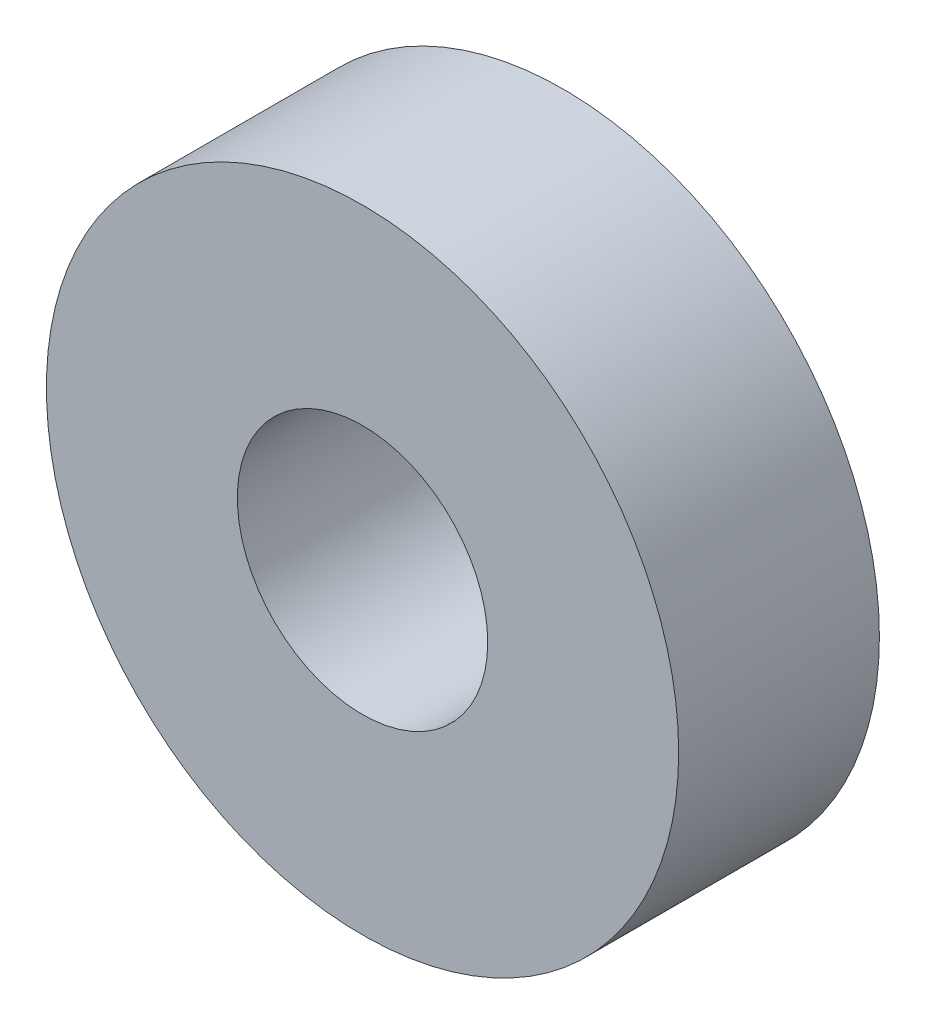
ISO-10303-21;
HEADER;
FILE_DESCRIPTION(('STEP AP214'),'2;1');
FILE_NAME('part.step','',(''),(''),'','','');
FILE_SCHEMA(('AUTOMOTIVE_DESIGN { 1 0 10303 214 1 1 1 1 }'));
ENDSEC;
DATA;
#1=APPLICATION_CONTEXT('core data for automotive mechanical design processes');
#2=APPLICATION_PROTOCOL_DEFINITION('international standard','automotive_design',2000,#1);
#3=PRODUCT_CONTEXT('',#1,'mechanical');
#4=PRODUCT('Part','Part','',(#3));
#5=PRODUCT_RELATED_PRODUCT_CATEGORY('part','',(#4));
#6=PRODUCT_DEFINITION_FORMATION('','',#4);
#7=PRODUCT_DEFINITION_CONTEXT('part definition',#1,'design');
#8=PRODUCT_DEFINITION('design','',#6,#7);
#9=PRODUCT_DEFINITION_SHAPE('','',#8);
#10=(LENGTH_UNIT() NAMED_UNIT(*) SI_UNIT(.MILLI.,.METRE.));
#11=(NAMED_UNIT(*) PLANE_ANGLE_UNIT() SI_UNIT($,.RADIAN.));
#12=(NAMED_UNIT(*) SI_UNIT($,.STERADIAN.) SOLID_ANGLE_UNIT());
#13=UNCERTAINTY_MEASURE_WITH_UNIT(LENGTH_MEASURE(1.E-05),#10,'distance_accuracy_value','');
#14=(GEOMETRIC_REPRESENTATION_CONTEXT(3) GLOBAL_UNCERTAINTY_ASSIGNED_CONTEXT((#13)) GLOBAL_UNIT_ASSIGNED_CONTEXT((#10,
#11,#12)) REPRESENTATION_CONTEXT('',''));
#15=CARTESIAN_POINT('',(0.,0.,0.));
#16=DIRECTION('',(0.,0.,1.));
#17=DIRECTION('',(1.,0.,0.));
#18=AXIS2_PLACEMENT_3D('',#15,#16,#17);
#19=CARTESIAN_POINT('',(0.,0.,6.35));
#20=DIRECTION('',(0.,0.,1.));
#21=DIRECTION('',(1.,0.,0.));
#22=AXIS2_PLACEMENT_3D('',#19,#20,#21);
#23=PLANE('',#22);
#24=CARTESIAN_POINT('',(0.,0.,6.35));
#25=DIRECTION('',(0.,0.,1.));
#26=DIRECTION('',(1.,0.,0.));
#27=AXIS2_PLACEMENT_3D('',#24,#25,#26);
#28=CIRCLE('',#27,10.);
#29=CARTESIAN_POINT('',(10.,0.,6.35));
#30=VERTEX_POINT('',#29);
#31=EDGE_CURVE('E10',#30,#30,#28,.T.);
#32=ORIENTED_EDGE('',*,*,#31,.T.);
#33=EDGE_LOOP('',(#32));
#34=FACE_BOUND('',#33,.T.);
#35=CARTESIAN_POINT('',(0.,0.,6.35));
#36=DIRECTION('',(0.,0.,1.));
#37=DIRECTION('',(1.,0.,0.));
#38=AXIS2_PLACEMENT_3D('',#35,#36,#37);
#39=CIRCLE('',#38,3.96);
#40=CARTESIAN_POINT('',(3.96,0.,6.35));
#41=VERTEX_POINT('',#40);
#42=EDGE_CURVE('E50',#41,#41,#39,.T.);
#43=ORIENTED_EDGE('',*,*,#42,.F.);
#44=EDGE_LOOP('',(#43));
#45=FACE_BOUND('',#44,.T.);
#46=ADVANCED_FACE('F37',(#34,#45),#23,.T.);
#47=CARTESIAN_POINT('',(0.,0.,0.));
#48=DIRECTION('',(0.,0.,1.));
#49=DIRECTION('',(1.,0.,0.));
#50=AXIS2_PLACEMENT_3D('',#47,#48,#49);
#51=PLANE('',#50);
#52=CARTESIAN_POINT('',(0.,0.,0.));
#53=DIRECTION('',(0.,0.,1.));
#54=DIRECTION('',(1.,0.,0.));
#55=AXIS2_PLACEMENT_3D('',#52,#53,#54);
#56=CIRCLE('',#55,10.);
#57=CARTESIAN_POINT('',(10.,0.,0.));
#58=VERTEX_POINT('',#57);
#59=EDGE_CURVE('E41',#58,#58,#56,.T.);
#60=ORIENTED_EDGE('',*,*,#59,.F.);
#61=EDGE_LOOP('',(#60));
#62=FACE_BOUND('',#61,.T.);
#63=CARTESIAN_POINT('',(0.,0.,0.));
#64=DIRECTION('',(0.,0.,1.));
#65=DIRECTION('',(1.,0.,0.));
#66=AXIS2_PLACEMENT_3D('',#63,#64,#65);
#67=CIRCLE('',#66,3.96);
#68=CARTESIAN_POINT('',(3.96,0.,0.));
#69=VERTEX_POINT('',#68);
#70=EDGE_CURVE('E52',#69,#69,#67,.T.);
#71=ORIENTED_EDGE('',*,*,#70,.T.);
#72=EDGE_LOOP('',(#71));
#73=FACE_BOUND('',#72,.T.);
#74=ADVANCED_FACE('F64',(#62,#73),#51,.F.);
#75=CARTESIAN_POINT('',(0.,0.,6.35));
#76=DIRECTION('',(0.,0.,-1.));
#77=DIRECTION('',(-1.,0.,0.));
#78=AXIS2_PLACEMENT_3D('',#75,#76,#77);
#79=CYLINDRICAL_SURFACE('',#78,10.);
#80=ORIENTED_EDGE('',*,*,#31,.F.);
#81=EDGE_LOOP('',(#80));
#82=FACE_BOUND('',#81,.T.);
#83=ORIENTED_EDGE('',*,*,#59,.T.);
#84=EDGE_LOOP('',(#83));
#85=FACE_BOUND('',#84,.T.);
#86=ADVANCED_FACE('F39',(#82,#85),#79,.T.);
#87=CARTESIAN_POINT('',(0.,0.,6.35));
#88=DIRECTION('',(0.,0.,-1.));
#89=DIRECTION('',(-1.,0.,0.));
#90=AXIS2_PLACEMENT_3D('',#87,#88,#89);
#91=CYLINDRICAL_SURFACE('',#90,3.96);
#92=ORIENTED_EDGE('',*,*,#42,.T.);
#93=EDGE_LOOP('',(#92));
#94=FACE_BOUND('',#93,.T.);
#95=ORIENTED_EDGE('',*,*,#70,.F.);
#96=EDGE_LOOP('',(#95));
#97=FACE_BOUND('',#96,.T.);
#98=ADVANCED_FACE('F60',(#94,#97),#91,.F.);
#99=CLOSED_SHELL('',(#46,#74,#86,#98));
#100=MANIFOLD_SOLID_BREP('B2',#99);
#101=ADVANCED_BREP_SHAPE_REPRESENTATION('',(#18,#100),#14);
#102=SHAPE_DEFINITION_REPRESENTATION(#9,#101);
ENDSEC;
END-ISO-10303-21;
